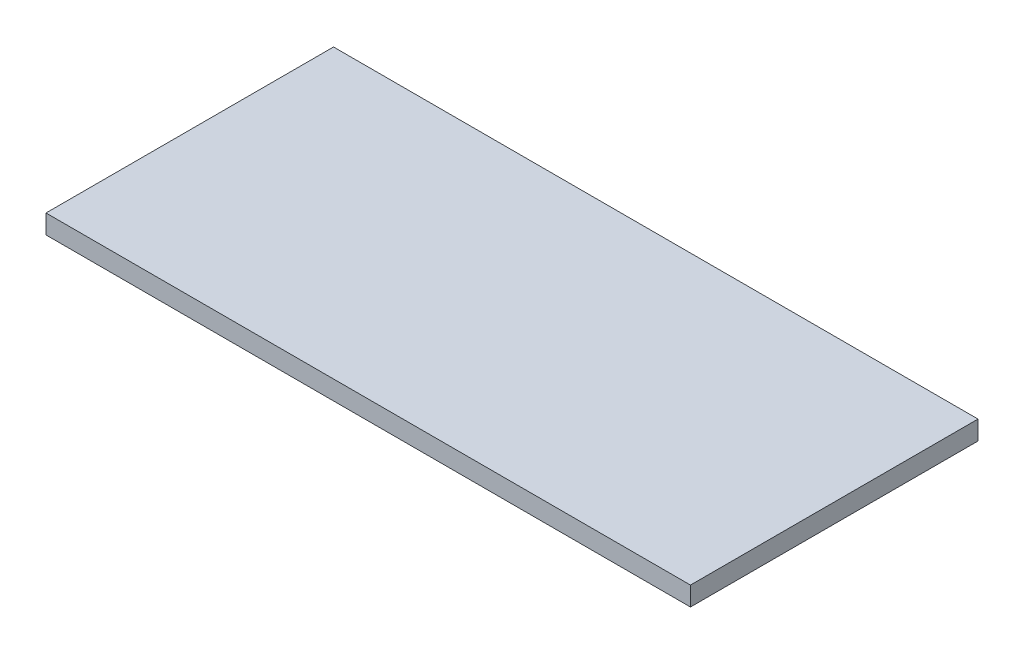
ISO-10303-21;
HEADER;
FILE_DESCRIPTION(('STEP AP214'),'2;1');
FILE_NAME('part.step','',(''),(''),'','','');
FILE_SCHEMA(('AUTOMOTIVE_DESIGN { 1 0 10303 214 1 1 1 1 }'));
ENDSEC;
DATA;
#1=APPLICATION_CONTEXT('core data for automotive mechanical design processes');
#2=APPLICATION_PROTOCOL_DEFINITION('international standard','automotive_design',2000,#1);
#3=PRODUCT_CONTEXT('',#1,'mechanical');
#4=PRODUCT('Part','Part','',(#3));
#5=PRODUCT_RELATED_PRODUCT_CATEGORY('part','',(#4));
#6=PRODUCT_DEFINITION_FORMATION('','',#4);
#7=PRODUCT_DEFINITION_CONTEXT('part definition',#1,'design');
#8=PRODUCT_DEFINITION('design','',#6,#7);
#9=PRODUCT_DEFINITION_SHAPE('','',#8);
#10=(LENGTH_UNIT() NAMED_UNIT(*) SI_UNIT(.MILLI.,.METRE.));
#11=(NAMED_UNIT(*) PLANE_ANGLE_UNIT() SI_UNIT($,.RADIAN.));
#12=(NAMED_UNIT(*) SI_UNIT($,.STERADIAN.) SOLID_ANGLE_UNIT());
#13=UNCERTAINTY_MEASURE_WITH_UNIT(LENGTH_MEASURE(1.E-05),#10,'distance_accuracy_value','');
#14=(GEOMETRIC_REPRESENTATION_CONTEXT(3) GLOBAL_UNCERTAINTY_ASSIGNED_CONTEXT((#13)) GLOBAL_UNIT_ASSIGNED_CONTEXT((#10,
#11,#12)) REPRESENTATION_CONTEXT('',''));
#15=CARTESIAN_POINT('',(0.,0.,0.));
#16=DIRECTION('',(0.,0.,1.));
#17=DIRECTION('',(1.,0.,0.));
#18=AXIS2_PLACEMENT_3D('',#15,#16,#17);
#19=CARTESIAN_POINT('',(25.796875,1.524,11.509375));
#20=DIRECTION('',(-1.,0.,0.));
#21=DIRECTION('',(0.,0.,1.));
#22=AXIS2_PLACEMENT_3D('',#19,#20,#21);
#23=PLANE('',#22);
#24=DIRECTION('',(0.,0.,-1.));
#25=VECTOR('',#24,1.);
#26=CARTESIAN_POINT('',(25.796875,0.,11.509375));
#27=LINE('',#26,#25);
#28=CARTESIAN_POINT('',(25.796875,0.,11.509375));
#29=VERTEX_POINT('',#28);
#30=CARTESIAN_POINT('',(25.796875,0.,-11.509375));
#31=VERTEX_POINT('',#30);
#32=EDGE_CURVE('E94',#29,#31,#27,.T.);
#33=ORIENTED_EDGE('',*,*,#32,.T.);
#34=DIRECTION('',(0.,-1.,0.));
#35=VECTOR('',#34,1.);
#36=CARTESIAN_POINT('',(25.796875,1.524,-11.509375));
#37=LINE('',#36,#35);
#38=CARTESIAN_POINT('',(25.796875,1.524,-11.509375));
#39=VERTEX_POINT('',#38);
#40=EDGE_CURVE('E11',#39,#31,#37,.T.);
#41=ORIENTED_EDGE('',*,*,#40,.F.);
#42=DIRECTION('',(0.,0.,-1.));
#43=VECTOR('',#42,1.);
#44=CARTESIAN_POINT('',(25.796875,1.524,11.509375));
#45=LINE('',#44,#43);
#46=CARTESIAN_POINT('',(25.796875,1.524,11.509375));
#47=VERTEX_POINT('',#46);
#48=EDGE_CURVE('E82',#47,#39,#45,.T.);
#49=ORIENTED_EDGE('',*,*,#48,.F.);
#50=DIRECTION('',(0.,-1.,0.));
#51=VECTOR('',#50,1.);
#52=CARTESIAN_POINT('',(25.796875,1.524,11.509375));
#53=LINE('',#52,#51);
#54=EDGE_CURVE('E90',#47,#29,#53,.T.);
#55=ORIENTED_EDGE('',*,*,#54,.T.);
#56=EDGE_LOOP('',(#33,#41,#49,#55));
#57=FACE_BOUND('',#56,.T.);
#58=ADVANCED_FACE('F31',(#57),#23,.F.);
#59=CARTESIAN_POINT('',(-25.796875,1.524,-11.509375));
#60=DIRECTION('',(0.,0.,1.));
#61=DIRECTION('',(1.,0.,0.));
#62=AXIS2_PLACEMENT_3D('',#59,#60,#61);
#63=PLANE('',#62);
#64=DIRECTION('',(-1.,0.,0.));
#65=VECTOR('',#64,1.);
#66=CARTESIAN_POINT('',(-25.796875,0.,-11.509375));
#67=LINE('',#66,#65);
#68=CARTESIAN_POINT('',(-25.796875,0.,-11.509375));
#69=VERTEX_POINT('',#68);
#70=EDGE_CURVE('E86',#31,#69,#67,.T.);
#71=ORIENTED_EDGE('',*,*,#70,.T.);
#72=DIRECTION('',(0.,-1.,0.));
#73=VECTOR('',#72,1.);
#74=CARTESIAN_POINT('',(-25.796875,1.524,-11.509375));
#75=LINE('',#74,#73);
#76=CARTESIAN_POINT('',(-25.796875,1.524,-11.509375));
#77=VERTEX_POINT('',#76);
#78=EDGE_CURVE('E39',#77,#69,#75,.T.);
#79=ORIENTED_EDGE('',*,*,#78,.F.);
#80=DIRECTION('',(-1.,0.,0.));
#81=VECTOR('',#80,1.);
#82=CARTESIAN_POINT('',(-25.796875,1.524,-11.509375));
#83=LINE('',#82,#81);
#84=EDGE_CURVE('E77',#39,#77,#83,.T.);
#85=ORIENTED_EDGE('',*,*,#84,.F.);
#86=ORIENTED_EDGE('',*,*,#40,.T.);
#87=EDGE_LOOP('',(#71,#79,#85,#86));
#88=FACE_BOUND('',#87,.T.);
#89=ADVANCED_FACE('F85',(#88),#63,.F.);
#90=CARTESIAN_POINT('',(-25.796875,1.524,11.509375));
#91=DIRECTION('',(1.,0.,0.));
#92=DIRECTION('',(0.,0.,-1.));
#93=AXIS2_PLACEMENT_3D('',#90,#91,#92);
#94=PLANE('',#93);
#95=DIRECTION('',(0.,0.,1.));
#96=VECTOR('',#95,1.);
#97=CARTESIAN_POINT('',(-25.796875,0.,11.509375));
#98=LINE('',#97,#96);
#99=CARTESIAN_POINT('',(-25.796875,0.,11.509375));
#100=VERTEX_POINT('',#99);
#101=EDGE_CURVE('E64',#69,#100,#98,.T.);
#102=ORIENTED_EDGE('',*,*,#101,.T.);
#103=DIRECTION('',(0.,-1.,0.));
#104=VECTOR('',#103,1.);
#105=CARTESIAN_POINT('',(-25.796875,1.524,11.509375));
#106=LINE('',#105,#104);
#107=CARTESIAN_POINT('',(-25.796875,1.524,11.509375));
#108=VERTEX_POINT('',#107);
#109=EDGE_CURVE('E87',#108,#100,#106,.T.);
#110=ORIENTED_EDGE('',*,*,#109,.F.);
#111=DIRECTION('',(0.,0.,1.));
#112=VECTOR('',#111,1.);
#113=CARTESIAN_POINT('',(-25.796875,1.524,11.509375));
#114=LINE('',#113,#112);
#115=EDGE_CURVE('E80',#77,#108,#114,.T.);
#116=ORIENTED_EDGE('',*,*,#115,.F.);
#117=ORIENTED_EDGE('',*,*,#78,.T.);
#118=EDGE_LOOP('',(#102,#110,#116,#117));
#119=FACE_BOUND('',#118,.T.);
#120=ADVANCED_FACE('F88',(#119),#94,.F.);
#121=CARTESIAN_POINT('',(-25.796875,1.524,11.509375));
#122=DIRECTION('',(0.,0.,-1.));
#123=DIRECTION('',(-1.,0.,0.));
#124=AXIS2_PLACEMENT_3D('',#121,#122,#123);
#125=PLANE('',#124);
#126=DIRECTION('',(1.,0.,0.));
#127=VECTOR('',#126,1.);
#128=CARTESIAN_POINT('',(-25.796875,0.,11.509375));
#129=LINE('',#128,#127);
#130=EDGE_CURVE('E70',#100,#29,#129,.T.);
#131=ORIENTED_EDGE('',*,*,#130,.T.);
#132=ORIENTED_EDGE('',*,*,#54,.F.);
#133=DIRECTION('',(1.,0.,0.));
#134=VECTOR('',#133,1.);
#135=CARTESIAN_POINT('',(-25.796875,1.524,11.509375));
#136=LINE('',#135,#134);
#137=EDGE_CURVE('E47',#108,#47,#136,.T.);
#138=ORIENTED_EDGE('',*,*,#137,.F.);
#139=ORIENTED_EDGE('',*,*,#109,.T.);
#140=EDGE_LOOP('',(#131,#132,#138,#139));
#141=FACE_BOUND('',#140,.T.);
#142=ADVANCED_FACE('F101',(#141),#125,.F.);
#143=CARTESIAN_POINT('',(25.796875,1.524,-11.509375));
#144=DIRECTION('',(0.,-1.,0.));
#145=DIRECTION('',(0.,0.,-1.));
#146=AXIS2_PLACEMENT_3D('',#143,#144,#145);
#147=PLANE('',#146);
#148=ORIENTED_EDGE('',*,*,#48,.T.);
#149=ORIENTED_EDGE('',*,*,#84,.T.);
#150=ORIENTED_EDGE('',*,*,#115,.T.);
#151=ORIENTED_EDGE('',*,*,#137,.T.);
#152=EDGE_LOOP('',(#148,#149,#150,#151));
#153=FACE_BOUND('',#152,.T.);
#154=ADVANCED_FACE('F78',(#153),#147,.F.);
#155=CARTESIAN_POINT('',(25.796875,0.,-11.509375));
#156=DIRECTION('',(0.,-1.,0.));
#157=DIRECTION('',(0.,0.,-1.));
#158=AXIS2_PLACEMENT_3D('',#155,#156,#157);
#159=PLANE('',#158);
#160=ORIENTED_EDGE('',*,*,#32,.F.);
#161=ORIENTED_EDGE('',*,*,#130,.F.);
#162=ORIENTED_EDGE('',*,*,#101,.F.);
#163=ORIENTED_EDGE('',*,*,#70,.F.);
#164=EDGE_LOOP('',(#160,#161,#162,#163));
#165=FACE_BOUND('',#164,.T.);
#166=ADVANCED_FACE('F104',(#165),#159,.T.);
#167=CLOSED_SHELL('',(#58,#89,#120,#142,#154,#166));
#168=MANIFOLD_SOLID_BREP('B2',#167);
#169=ADVANCED_BREP_SHAPE_REPRESENTATION('',(#18,#168),#14);
#170=SHAPE_DEFINITION_REPRESENTATION(#9,#169);
ENDSEC;
END-ISO-10303-21;
